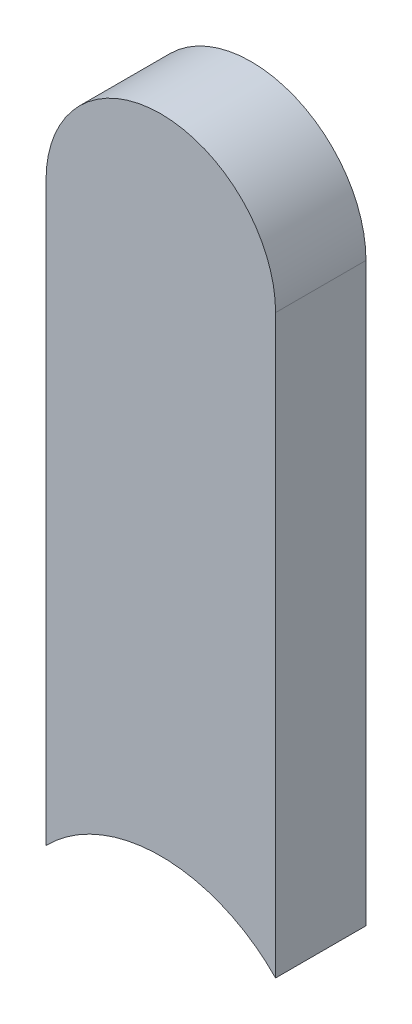
ISO-10303-21;
HEADER;
FILE_DESCRIPTION(('STEP AP214'),'2;1');
FILE_NAME('part.step','',(''),(''),'','','');
FILE_SCHEMA(('AUTOMOTIVE_DESIGN { 1 0 10303 214 1 1 1 1 }'));
ENDSEC;
DATA;
#1=APPLICATION_CONTEXT('core data for automotive mechanical design processes');
#2=APPLICATION_PROTOCOL_DEFINITION('international standard','automotive_design',2000,#1);
#3=PRODUCT_CONTEXT('',#1,'mechanical');
#4=PRODUCT('Part','Part','',(#3));
#5=PRODUCT_RELATED_PRODUCT_CATEGORY('part','',(#4));
#6=PRODUCT_DEFINITION_FORMATION('','',#4);
#7=PRODUCT_DEFINITION_CONTEXT('part definition',#1,'design');
#8=PRODUCT_DEFINITION('design','',#6,#7);
#9=PRODUCT_DEFINITION_SHAPE('','',#8);
#10=(LENGTH_UNIT() NAMED_UNIT(*) SI_UNIT(.MILLI.,.METRE.));
#11=(NAMED_UNIT(*) PLANE_ANGLE_UNIT() SI_UNIT($,.RADIAN.));
#12=(NAMED_UNIT(*) SI_UNIT($,.STERADIAN.) SOLID_ANGLE_UNIT());
#13=UNCERTAINTY_MEASURE_WITH_UNIT(LENGTH_MEASURE(1.E-05),#10,'distance_accuracy_value','');
#14=(GEOMETRIC_REPRESENTATION_CONTEXT(3) GLOBAL_UNCERTAINTY_ASSIGNED_CONTEXT((#13)) GLOBAL_UNIT_ASSIGNED_CONTEXT((#10,
#11,#12)) REPRESENTATION_CONTEXT('',''));
#15=CARTESIAN_POINT('',(0.,0.,0.));
#16=DIRECTION('',(0.,0.,1.));
#17=DIRECTION('',(1.,0.,0.));
#18=AXIS2_PLACEMENT_3D('',#15,#16,#17);
#19=CARTESIAN_POINT('',(115.062,56.6368681578668,0.));
#20=DIRECTION('',(-1.,0.,0.));
#21=DIRECTION('',(0.,1.,0.));
#22=AXIS2_PLACEMENT_3D('',#19,#20,#21);
#23=PLANE('',#22);
#24=DIRECTION('',(0.,1.,0.));
#25=VECTOR('',#24,1.);
#26=CARTESIAN_POINT('',(115.062,56.388,0.1999996));
#27=LINE('',#26,#25);
#28=CARTESIAN_POINT('',(115.062,56.6368681578668,0.1999996));
#29=VERTEX_POINT('',#28);
#30=CARTESIAN_POINT('',(115.062,57.912,0.1999996));
#31=VERTEX_POINT('',#30);
#32=EDGE_CURVE('E11',#29,#31,#27,.T.);
#33=ORIENTED_EDGE('',*,*,#32,.F.);
#34=DIRECTION('',(0.,0.,1.));
#35=VECTOR('',#34,1.);
#36=CARTESIAN_POINT('',(115.062,56.6368681578668,0.));
#37=LINE('',#36,#35);
#38=CARTESIAN_POINT('',(115.062,56.6368681578668,0.));
#39=VERTEX_POINT('',#38);
#40=EDGE_CURVE('E24',#39,#29,#37,.T.);
#41=ORIENTED_EDGE('',*,*,#40,.F.);
#42=DIRECTION('',(0.,1.,0.));
#43=VECTOR('',#42,1.);
#44=CARTESIAN_POINT('',(115.062,56.388,0.));
#45=LINE('',#44,#43);
#46=CARTESIAN_POINT('',(115.062,57.912,0.));
#47=VERTEX_POINT('',#46);
#48=EDGE_CURVE('E75',#39,#47,#45,.T.);
#49=ORIENTED_EDGE('',*,*,#48,.T.);
#50=DIRECTION('',(0.,0.,1.));
#51=VECTOR('',#50,1.);
#52=CARTESIAN_POINT('',(115.062,57.912,0.));
#53=LINE('',#52,#51);
#54=EDGE_CURVE('E37',#47,#31,#53,.T.);
#55=ORIENTED_EDGE('',*,*,#54,.T.);
#56=EDGE_LOOP('',(#33,#41,#49,#55));
#57=FACE_BOUND('',#56,.T.);
#58=ADVANCED_FACE('F17',(#57),#23,.F.);
#59=CARTESIAN_POINT('',(114.808,57.912,0.));
#60=DIRECTION('',(0.,0.,-1.));
#61=DIRECTION('',(1.,0.,0.));
#62=AXIS2_PLACEMENT_3D('',#59,#60,#61);
#63=CYLINDRICAL_SURFACE('',#62,0.253999999999995);
#64=CARTESIAN_POINT('',(114.808,57.912,0.1999996));
#65=DIRECTION('',(0.,0.,1.));
#66=DIRECTION('',(1.,0.,0.));
#67=AXIS2_PLACEMENT_3D('',#64,#65,#66);
#68=CIRCLE('',#67,0.253999999999995);
#69=CARTESIAN_POINT('',(114.554,57.912,0.1999996));
#70=VERTEX_POINT('',#69);
#71=EDGE_CURVE('E83',#31,#70,#68,.T.);
#72=ORIENTED_EDGE('',*,*,#71,.F.);
#73=ORIENTED_EDGE('',*,*,#54,.F.);
#74=CARTESIAN_POINT('',(114.808,57.912,0.));
#75=DIRECTION('',(0.,0.,1.));
#76=DIRECTION('',(1.,0.,0.));
#77=AXIS2_PLACEMENT_3D('',#74,#75,#76);
#78=CIRCLE('',#77,0.253999999999995);
#79=CARTESIAN_POINT('',(114.554,57.912,0.));
#80=VERTEX_POINT('',#79);
#81=EDGE_CURVE('E81',#47,#80,#78,.T.);
#82=ORIENTED_EDGE('',*,*,#81,.T.);
#83=DIRECTION('',(0.,0.,1.));
#84=VECTOR('',#83,1.);
#85=CARTESIAN_POINT('',(114.554,57.912,0.));
#86=LINE('',#85,#84);
#87=EDGE_CURVE('E67',#80,#70,#86,.T.);
#88=ORIENTED_EDGE('',*,*,#87,.T.);
#89=EDGE_LOOP('',(#72,#73,#82,#88));
#90=FACE_BOUND('',#89,.T.);
#91=ADVANCED_FACE('F89',(#90),#63,.T.);
#92=CARTESIAN_POINT('',(114.554,57.912,0.));
#93=DIRECTION('',(1.,0.,0.));
#94=DIRECTION('',(0.,-1.,0.));
#95=AXIS2_PLACEMENT_3D('',#92,#93,#94);
#96=PLANE('',#95);
#97=DIRECTION('',(0.,-1.,0.));
#98=VECTOR('',#97,1.);
#99=CARTESIAN_POINT('',(114.554,57.912,0.1999996));
#100=LINE('',#99,#98);
#101=CARTESIAN_POINT('',(114.554,56.6368681578668,0.1999996));
#102=VERTEX_POINT('',#101);
#103=EDGE_CURVE('E71',#70,#102,#100,.T.);
#104=ORIENTED_EDGE('',*,*,#103,.F.);
#105=ORIENTED_EDGE('',*,*,#87,.F.);
#106=DIRECTION('',(0.,-1.,0.));
#107=VECTOR('',#106,1.);
#108=CARTESIAN_POINT('',(114.554,57.912,0.));
#109=LINE('',#108,#107);
#110=CARTESIAN_POINT('',(114.554,56.6368681578668,0.));
#111=VERTEX_POINT('',#110);
#112=EDGE_CURVE('E63',#80,#111,#109,.T.);
#113=ORIENTED_EDGE('',*,*,#112,.T.);
#114=DIRECTION('',(0.,0.,1.));
#115=VECTOR('',#114,1.);
#116=CARTESIAN_POINT('',(114.554,56.6368681578668,0.));
#117=LINE('',#116,#115);
#118=EDGE_CURVE('E53',#111,#102,#117,.T.);
#119=ORIENTED_EDGE('',*,*,#118,.T.);
#120=EDGE_LOOP('',(#104,#105,#113,#119));
#121=FACE_BOUND('',#120,.T.);
#122=ADVANCED_FACE('F66',(#121),#96,.F.);
#123=CARTESIAN_POINT('',(114.808,56.388,0.));
#124=DIRECTION('',(0.,0.,-1.));
#125=DIRECTION('',(1.,0.,0.));
#126=AXIS2_PLACEMENT_3D('',#123,#124,#125);
#127=CYLINDRICAL_SURFACE('',#126,0.3556);
#128=ORIENTED_EDGE('',*,*,#40,.T.);
#129=CARTESIAN_POINT('',(114.808,56.388,0.1999996));
#130=DIRECTION('',(0.,0.,1.));
#131=DIRECTION('',(1.,0.,0.));
#132=AXIS2_PLACEMENT_3D('',#129,#130,#131);
#133=CIRCLE('',#132,0.3556);
#134=EDGE_CURVE('E59',#29,#102,#133,.T.);
#135=ORIENTED_EDGE('',*,*,#134,.T.);
#136=ORIENTED_EDGE('',*,*,#118,.F.);
#137=CARTESIAN_POINT('',(114.808,56.388,0.));
#138=DIRECTION('',(0.,0.,1.));
#139=DIRECTION('',(1.,0.,0.));
#140=AXIS2_PLACEMENT_3D('',#137,#138,#139);
#141=CIRCLE('',#140,0.3556);
#142=EDGE_CURVE('E57',#39,#111,#141,.T.);
#143=ORIENTED_EDGE('',*,*,#142,.F.);
#144=EDGE_LOOP('',(#128,#135,#136,#143));
#145=FACE_BOUND('',#144,.T.);
#146=ADVANCED_FACE('F55',(#145),#127,.F.);
#147=CARTESIAN_POINT('',(115.062,56.388,0.));
#148=DIRECTION('',(0.,0.,-1.));
#149=DIRECTION('',(-1.,0.,0.));
#150=AXIS2_PLACEMENT_3D('',#147,#148,#149);
#151=PLANE('',#150);
#152=ORIENTED_EDGE('',*,*,#48,.F.);
#153=ORIENTED_EDGE('',*,*,#142,.T.);
#154=ORIENTED_EDGE('',*,*,#112,.F.);
#155=ORIENTED_EDGE('',*,*,#81,.F.);
#156=EDGE_LOOP('',(#152,#153,#154,#155));
#157=FACE_BOUND('',#156,.T.);
#158=ADVANCED_FACE('F74',(#157),#151,.T.);
#159=CARTESIAN_POINT('',(115.062,56.388,0.1999996));
#160=DIRECTION('',(0.,0.,-1.));
#161=DIRECTION('',(-1.,0.,0.));
#162=AXIS2_PLACEMENT_3D('',#159,#160,#161);
#163=PLANE('',#162);
#164=ORIENTED_EDGE('',*,*,#134,.F.);
#165=ORIENTED_EDGE('',*,*,#32,.T.);
#166=ORIENTED_EDGE('',*,*,#71,.T.);
#167=ORIENTED_EDGE('',*,*,#103,.T.);
#168=EDGE_LOOP('',(#164,#165,#166,#167));
#169=FACE_BOUND('',#168,.T.);
#170=ADVANCED_FACE('F91',(#169),#163,.F.);
#171=CLOSED_SHELL('',(#58,#91,#122,#146,#158,#170));
#172=MANIFOLD_SOLID_BREP('B1',#171);
#173=ADVANCED_BREP_SHAPE_REPRESENTATION('',(#18,#172),#14);
#174=SHAPE_DEFINITION_REPRESENTATION(#9,#173);
ENDSEC;
END-ISO-10303-21;
